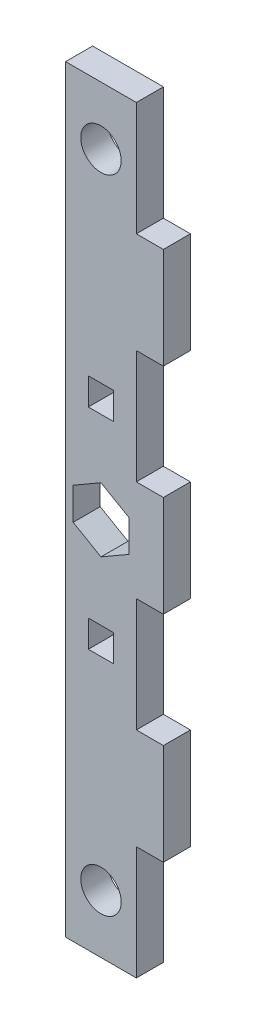
ISO-10303-21;
HEADER;
FILE_DESCRIPTION(('STEP AP214'),'2;1');
FILE_NAME('part.step','',(''),(''),'','','');
FILE_SCHEMA(('AUTOMOTIVE_DESIGN { 1 0 10303 214 1 1 1 1 }'));
ENDSEC;
DATA;
#1=APPLICATION_CONTEXT('core data for automotive mechanical design processes');
#2=APPLICATION_PROTOCOL_DEFINITION('international standard','automotive_design',2000,#1);
#3=PRODUCT_CONTEXT('',#1,'mechanical');
#4=PRODUCT('Part','Part','',(#3));
#5=PRODUCT_RELATED_PRODUCT_CATEGORY('part','',(#4));
#6=PRODUCT_DEFINITION_FORMATION('','',#4);
#7=PRODUCT_DEFINITION_CONTEXT('part definition',#1,'design');
#8=PRODUCT_DEFINITION('design','',#6,#7);
#9=PRODUCT_DEFINITION_SHAPE('','',#8);
#10=(LENGTH_UNIT() NAMED_UNIT(*) SI_UNIT(.MILLI.,.METRE.));
#11=(NAMED_UNIT(*) PLANE_ANGLE_UNIT() SI_UNIT($,.RADIAN.));
#12=(NAMED_UNIT(*) SI_UNIT($,.STERADIAN.) SOLID_ANGLE_UNIT());
#13=UNCERTAINTY_MEASURE_WITH_UNIT(LENGTH_MEASURE(1.E-05),#10,'distance_accuracy_value','');
#14=(GEOMETRIC_REPRESENTATION_CONTEXT(3) GLOBAL_UNCERTAINTY_ASSIGNED_CONTEXT((#13)) GLOBAL_UNIT_ASSIGNED_CONTEXT((#10,
#11,#12)) REPRESENTATION_CONTEXT('',''));
#15=CARTESIAN_POINT('',(0.,0.,0.));
#16=DIRECTION('',(0.,0.,1.));
#17=DIRECTION('',(1.,0.,0.));
#18=AXIS2_PLACEMENT_3D('',#15,#16,#17);
#19=CARTESIAN_POINT('',(0.,0.,5.35));
#20=DIRECTION('',(0.,0.,-1.));
#21=DIRECTION('',(-1.,0.,0.));
#22=AXIS2_PLACEMENT_3D('',#19,#20,#21);
#23=PLANE('',#22);
#24=DIRECTION('',(0.,-1.,0.));
#25=VECTOR('',#24,1.);
#26=CARTESIAN_POINT('',(4.49999999999999,56.925,5.35));
#27=LINE('',#26,#25);
#28=CARTESIAN_POINT('',(4.49999999999999,56.925,5.35));
#29=VERTEX_POINT('',#28);
#30=CARTESIAN_POINT('',(4.49999999999999,51.575,5.35));
#31=VERTEX_POINT('',#30);
#32=EDGE_CURVE('E285',#29,#31,#27,.T.);
#33=ORIENTED_EDGE('',*,*,#32,.F.);
#34=DIRECTION('',(-1.,0.,0.));
#35=VECTOR('',#34,1.);
#36=CARTESIAN_POINT('',(4.49999999999999,56.925,5.35));
#37=LINE('',#36,#35);
#38=CARTESIAN_POINT('',(9.49999999999999,56.925,5.35));
#39=VERTEX_POINT('',#38);
#40=EDGE_CURVE('E293',#39,#29,#37,.T.);
#41=ORIENTED_EDGE('',*,*,#40,.F.);
#42=DIRECTION('',(0.,1.,0.));
#43=VECTOR('',#42,1.);
#44=CARTESIAN_POINT('',(9.49999999999999,56.925,5.35));
#45=LINE('',#44,#43);
#46=CARTESIAN_POINT('',(9.49999999999999,51.575,5.35));
#47=VERTEX_POINT('',#46);
#48=EDGE_CURVE('E290',#47,#39,#45,.T.);
#49=ORIENTED_EDGE('',*,*,#48,.F.);
#50=DIRECTION('',(1.,0.,0.));
#51=VECTOR('',#50,1.);
#52=CARTESIAN_POINT('',(4.49999999999999,51.575,5.35));
#53=LINE('',#52,#51);
#54=EDGE_CURVE('E287',#31,#47,#53,.T.);
#55=ORIENTED_EDGE('',*,*,#54,.F.);
#56=EDGE_LOOP('',(#33,#41,#49,#55));
#57=FACE_BOUND('',#56,.T.);
#58=CARTESIAN_POINT('',(7.,138.5,5.35));
#59=DIRECTION('',(0.,0.,1.));
#60=DIRECTION('',(1.,0.,0.));
#61=AXIS2_PLACEMENT_3D('',#58,#59,#60);
#62=CIRCLE('',#61,4.);
#63=CARTESIAN_POINT('',(11.,138.5,5.35));
#64=VERTEX_POINT('',#63);
#65=EDGE_CURVE('E347',#64,#64,#62,.T.);
#66=ORIENTED_EDGE('',*,*,#65,.F.);
#67=EDGE_LOOP('',(#66));
#68=FACE_BOUND('',#67,.T.);
#69=DIRECTION('',(0.,-1.,0.));
#70=VECTOR('',#69,1.);
#71=CARTESIAN_POINT('',(0.,0.,5.35));
#72=LINE('',#71,#70);
#73=CARTESIAN_POINT('',(0.,150.,5.35));
#74=VERTEX_POINT('',#73);
#75=CARTESIAN_POINT('',(0.,0.,5.35));
#76=VERTEX_POINT('',#75);
#77=EDGE_CURVE('E353',#74,#76,#72,.T.);
#78=ORIENTED_EDGE('',*,*,#77,.T.);
#79=DIRECTION('',(1.,0.,0.));
#80=VECTOR('',#79,1.);
#81=CARTESIAN_POINT('',(0.,0.,5.35));
#82=LINE('',#81,#80);
#83=CARTESIAN_POINT('',(14.,0.,5.35));
#84=VERTEX_POINT('',#83);
#85=EDGE_CURVE('E356',#76,#84,#82,.T.);
#86=ORIENTED_EDGE('',*,*,#85,.T.);
#87=DIRECTION('',(0.,1.,0.));
#88=VECTOR('',#87,1.);
#89=CARTESIAN_POINT('',(14.,0.,5.35));
#90=LINE('',#89,#88);
#91=CARTESIAN_POINT('',(14.,22.5,5.35));
#92=VERTEX_POINT('',#91);
#93=EDGE_CURVE('E359',#84,#92,#90,.T.);
#94=ORIENTED_EDGE('',*,*,#93,.T.);
#95=DIRECTION('',(1.,0.,0.));
#96=VECTOR('',#95,1.);
#97=CARTESIAN_POINT('',(14.,22.5,5.35));
#98=LINE('',#97,#96);
#99=CARTESIAN_POINT('',(19.35,22.5,5.35));
#100=VERTEX_POINT('',#99);
#101=EDGE_CURVE('E361',#92,#100,#98,.T.);
#102=ORIENTED_EDGE('',*,*,#101,.T.);
#103=DIRECTION('',(0.,1.,0.));
#104=VECTOR('',#103,1.);
#105=CARTESIAN_POINT('',(19.35,22.5,5.35));
#106=LINE('',#105,#104);
#107=CARTESIAN_POINT('',(19.35,42.5,5.35));
#108=VERTEX_POINT('',#107);
#109=EDGE_CURVE('E363',#100,#108,#106,.T.);
#110=ORIENTED_EDGE('',*,*,#109,.T.);
#111=DIRECTION('',(-1.,0.,0.));
#112=VECTOR('',#111,1.);
#113=CARTESIAN_POINT('',(14.,42.5,5.35));
#114=LINE('',#113,#112);
#115=CARTESIAN_POINT('',(14.,42.5,5.35));
#116=VERTEX_POINT('',#115);
#117=EDGE_CURVE('E365',#108,#116,#114,.T.);
#118=ORIENTED_EDGE('',*,*,#117,.T.);
#119=DIRECTION('',(0.,1.,0.));
#120=VECTOR('',#119,1.);
#121=CARTESIAN_POINT('',(14.,42.5,5.35));
#122=LINE('',#121,#120);
#123=CARTESIAN_POINT('',(14.,65.,5.35));
#124=VERTEX_POINT('',#123);
#125=EDGE_CURVE('E367',#116,#124,#122,.T.);
#126=ORIENTED_EDGE('',*,*,#125,.T.);
#127=DIRECTION('',(1.,0.,0.));
#128=VECTOR('',#127,1.);
#129=CARTESIAN_POINT('',(14.,65.,5.35));
#130=LINE('',#129,#128);
#131=CARTESIAN_POINT('',(19.35,65.,5.35));
#132=VERTEX_POINT('',#131);
#133=EDGE_CURVE('E369',#124,#132,#130,.T.);
#134=ORIENTED_EDGE('',*,*,#133,.T.);
#135=DIRECTION('',(0.,1.,0.));
#136=VECTOR('',#135,1.);
#137=CARTESIAN_POINT('',(19.35,85.,5.35));
#138=LINE('',#137,#136);
#139=CARTESIAN_POINT('',(19.35,85.,5.35));
#140=VERTEX_POINT('',#139);
#141=EDGE_CURVE('E371',#132,#140,#138,.T.);
#142=ORIENTED_EDGE('',*,*,#141,.T.);
#143=DIRECTION('',(-1.,0.,0.));
#144=VECTOR('',#143,1.);
#145=CARTESIAN_POINT('',(14.,85.,5.35));
#146=LINE('',#145,#144);
#147=CARTESIAN_POINT('',(14.,85.,5.35));
#148=VERTEX_POINT('',#147);
#149=EDGE_CURVE('E373',#140,#148,#146,.T.);
#150=ORIENTED_EDGE('',*,*,#149,.T.);
#151=DIRECTION('',(0.,1.,0.));
#152=VECTOR('',#151,1.);
#153=CARTESIAN_POINT('',(14.,85.,5.35));
#154=LINE('',#153,#152);
#155=CARTESIAN_POINT('',(14.,107.5,5.35));
#156=VERTEX_POINT('',#155);
#157=EDGE_CURVE('E375',#148,#156,#154,.T.);
#158=ORIENTED_EDGE('',*,*,#157,.T.);
#159=DIRECTION('',(1.,0.,0.));
#160=VECTOR('',#159,1.);
#161=CARTESIAN_POINT('',(14.,107.5,5.35));
#162=LINE('',#161,#160);
#163=CARTESIAN_POINT('',(19.35,107.5,5.35));
#164=VERTEX_POINT('',#163);
#165=EDGE_CURVE('E377',#156,#164,#162,.T.);
#166=ORIENTED_EDGE('',*,*,#165,.T.);
#167=DIRECTION('',(0.,1.,0.));
#168=VECTOR('',#167,1.);
#169=CARTESIAN_POINT('',(19.35,127.5,5.35));
#170=LINE('',#169,#168);
#171=CARTESIAN_POINT('',(19.35,127.5,5.35));
#172=VERTEX_POINT('',#171);
#173=EDGE_CURVE('E379',#164,#172,#170,.T.);
#174=ORIENTED_EDGE('',*,*,#173,.T.);
#175=DIRECTION('',(-1.,0.,0.));
#176=VECTOR('',#175,1.);
#177=CARTESIAN_POINT('',(14.,127.5,5.35));
#178=LINE('',#177,#176);
#179=CARTESIAN_POINT('',(14.,127.5,5.35));
#180=VERTEX_POINT('',#179);
#181=EDGE_CURVE('E381',#172,#180,#178,.T.);
#182=ORIENTED_EDGE('',*,*,#181,.T.);
#183=DIRECTION('',(0.,1.,0.));
#184=VECTOR('',#183,1.);
#185=CARTESIAN_POINT('',(14.,127.5,5.35));
#186=LINE('',#185,#184);
#187=CARTESIAN_POINT('',(14.,150.,5.35));
#188=VERTEX_POINT('',#187);
#189=EDGE_CURVE('E383',#180,#188,#186,.T.);
#190=ORIENTED_EDGE('',*,*,#189,.T.);
#191=DIRECTION('',(-1.,0.,0.));
#192=VECTOR('',#191,1.);
#193=CARTESIAN_POINT('',(0.,150.,5.35));
#194=LINE('',#193,#192);
#195=EDGE_CURVE('E385',#188,#74,#194,.T.);
#196=ORIENTED_EDGE('',*,*,#195,.T.);
#197=EDGE_LOOP('',(#78,#86,#94,#102,#110,#118,#126,#134,#142,#150,#158,#166,#174,#182,#190,#196));
#198=FACE_BOUND('',#197,.T.);
#199=DIRECTION('',(0.,1.,0.));
#200=VECTOR('',#199,1.);
#201=CARTESIAN_POINT('',(9.49999999999999,93.075,5.35));
#202=LINE('',#201,#200);
#203=CARTESIAN_POINT('',(9.49999999999999,93.075,5.35));
#204=VERTEX_POINT('',#203);
#205=CARTESIAN_POINT('',(9.49999999999999,98.425,5.35));
#206=VERTEX_POINT('',#205);
#207=EDGE_CURVE('E316',#204,#206,#202,.T.);
#208=ORIENTED_EDGE('',*,*,#207,.F.);
#209=DIRECTION('',(1.,0.,0.));
#210=VECTOR('',#209,1.);
#211=CARTESIAN_POINT('',(4.49999999999999,93.075,5.35));
#212=LINE('',#211,#210);
#213=CARTESIAN_POINT('',(4.49999999999999,93.075,5.35));
#214=VERTEX_POINT('',#213);
#215=EDGE_CURVE('E324',#214,#204,#212,.T.);
#216=ORIENTED_EDGE('',*,*,#215,.F.);
#217=DIRECTION('',(0.,-1.,0.));
#218=VECTOR('',#217,1.);
#219=CARTESIAN_POINT('',(4.49999999999999,93.075,5.35));
#220=LINE('',#219,#218);
#221=CARTESIAN_POINT('',(4.49999999999999,98.425,5.35));
#222=VERTEX_POINT('',#221);
#223=EDGE_CURVE('E321',#222,#214,#220,.T.);
#224=ORIENTED_EDGE('',*,*,#223,.F.);
#225=DIRECTION('',(-1.,0.,0.));
#226=VECTOR('',#225,1.);
#227=CARTESIAN_POINT('',(4.49999999999999,98.425,5.35));
#228=LINE('',#227,#226);
#229=EDGE_CURVE('E318',#206,#222,#228,.T.);
#230=ORIENTED_EDGE('',*,*,#229,.F.);
#231=EDGE_LOOP('',(#208,#216,#224,#230));
#232=FACE_BOUND('',#231,.T.);
#233=DIRECTION('',(-0.866025403784439,0.5,0.));
#234=VECTOR('',#233,1.);
#235=CARTESIAN_POINT('',(12.5,78.1754264805429,5.35));
#236=LINE('',#235,#234);
#237=CARTESIAN_POINT('',(12.5,78.1754264805429,5.35));
#238=VERTEX_POINT('',#237);
#239=CARTESIAN_POINT('',(7.00000000000001,81.3508529610859,5.35));
#240=VERTEX_POINT('',#239);
#241=EDGE_CURVE('E231',#238,#240,#236,.T.);
#242=ORIENTED_EDGE('',*,*,#241,.F.);
#243=DIRECTION('',(0.,1.,0.));
#244=VECTOR('',#243,1.);
#245=CARTESIAN_POINT('',(12.5,71.8245735194571,5.35));
#246=LINE('',#245,#244);
#247=CARTESIAN_POINT('',(12.5,71.8245735194571,5.35));
#248=VERTEX_POINT('',#247);
#249=EDGE_CURVE('E262',#248,#238,#246,.T.);
#250=ORIENTED_EDGE('',*,*,#249,.F.);
#251=DIRECTION('',(0.866025403784438,0.500000000000001,0.));
#252=VECTOR('',#251,1.);
#253=CARTESIAN_POINT('',(6.99999999999999,68.6491470389141,5.35));
#254=LINE('',#253,#252);
#255=CARTESIAN_POINT('',(6.99999999999999,68.6491470389141,5.35));
#256=VERTEX_POINT('',#255);
#257=EDGE_CURVE('E260',#256,#248,#254,.T.);
#258=ORIENTED_EDGE('',*,*,#257,.F.);
#259=DIRECTION('',(0.866025403784438,-0.500000000000002,0.));
#260=VECTOR('',#259,1.);
#261=CARTESIAN_POINT('',(1.5,71.8245735194571,5.35));
#262=LINE('',#261,#260);
#263=CARTESIAN_POINT('',(1.5,71.8245735194571,5.35));
#264=VERTEX_POINT('',#263);
#265=EDGE_CURVE('E255',#264,#256,#262,.T.);
#266=ORIENTED_EDGE('',*,*,#265,.F.);
#267=DIRECTION('',(0.,-1.,0.));
#268=VECTOR('',#267,1.);
#269=CARTESIAN_POINT('',(1.5,78.1754264805429,5.35));
#270=LINE('',#269,#268);
#271=CARTESIAN_POINT('',(1.5,78.1754264805429,5.35));
#272=VERTEX_POINT('',#271);
#273=EDGE_CURVE('E253',#272,#264,#270,.T.);
#274=ORIENTED_EDGE('',*,*,#273,.F.);
#275=DIRECTION('',(-0.866025403784439,-0.5,0.));
#276=VECTOR('',#275,1.);
#277=CARTESIAN_POINT('',(7.00000000000001,81.3508529610859,5.35));
#278=LINE('',#277,#276);
#279=EDGE_CURVE('E239',#240,#272,#278,.T.);
#280=ORIENTED_EDGE('',*,*,#279,.F.);
#281=EDGE_LOOP('',(#242,#250,#258,#266,#274,#280));
#282=FACE_BOUND('',#281,.T.);
#283=CARTESIAN_POINT('',(7.,11.5,5.35));
#284=DIRECTION('',(0.,0.,1.));
#285=DIRECTION('',(-1.,0.,0.));
#286=AXIS2_PLACEMENT_3D('',#283,#284,#285);
#287=CIRCLE('',#286,4.);
#288=CARTESIAN_POINT('',(3.,11.5,5.35));
#289=VERTEX_POINT('',#288);
#290=EDGE_CURVE('E265',#289,#289,#287,.T.);
#291=ORIENTED_EDGE('',*,*,#290,.F.);
#292=EDGE_LOOP('',(#291));
#293=FACE_BOUND('',#292,.T.);
#294=ADVANCED_FACE('F34',(#57,#68,#198,#232,#282,#293),#23,.F.);
#295=CARTESIAN_POINT('',(0.,0.,0.));
#296=DIRECTION('',(0.,0.,-1.));
#297=DIRECTION('',(-1.,0.,0.));
#298=AXIS2_PLACEMENT_3D('',#295,#296,#297);
#299=PLANE('',#298);
#300=DIRECTION('',(0.,1.,0.));
#301=VECTOR('',#300,1.);
#302=CARTESIAN_POINT('',(12.5,71.8245735194571,0.));
#303=LINE('',#302,#301);
#304=CARTESIAN_POINT('',(12.5,71.8245735194571,0.));
#305=VERTEX_POINT('',#304);
#306=CARTESIAN_POINT('',(12.5,78.1754264805429,0.));
#307=VERTEX_POINT('',#306);
#308=EDGE_CURVE('E240',#305,#307,#303,.T.);
#309=ORIENTED_EDGE('',*,*,#308,.T.);
#310=DIRECTION('',(-0.866025403784439,0.5,0.));
#311=VECTOR('',#310,1.);
#312=CARTESIAN_POINT('',(12.5,78.1754264805429,0.));
#313=LINE('',#312,#311);
#314=CARTESIAN_POINT('',(7.00000000000001,81.3508529610859,0.));
#315=VERTEX_POINT('',#314);
#316=EDGE_CURVE('E57',#307,#315,#313,.T.);
#317=ORIENTED_EDGE('',*,*,#316,.T.);
#318=DIRECTION('',(-0.866025403784439,-0.5,0.));
#319=VECTOR('',#318,1.);
#320=CARTESIAN_POINT('',(7.00000000000001,81.3508529610859,0.));
#321=LINE('',#320,#319);
#322=CARTESIAN_POINT('',(1.5,78.1754264805429,0.));
#323=VERTEX_POINT('',#322);
#324=EDGE_CURVE('E246',#315,#323,#321,.T.);
#325=ORIENTED_EDGE('',*,*,#324,.T.);
#326=DIRECTION('',(0.,-1.,0.));
#327=VECTOR('',#326,1.);
#328=CARTESIAN_POINT('',(1.5,78.1754264805429,0.));
#329=LINE('',#328,#327);
#330=CARTESIAN_POINT('',(1.5,71.8245735194571,0.));
#331=VERTEX_POINT('',#330);
#332=EDGE_CURVE('E267',#323,#331,#329,.T.);
#333=ORIENTED_EDGE('',*,*,#332,.T.);
#334=DIRECTION('',(0.866025403784438,-0.500000000000002,0.));
#335=VECTOR('',#334,1.);
#336=CARTESIAN_POINT('',(1.5,71.8245735194571,0.));
#337=LINE('',#336,#335);
#338=CARTESIAN_POINT('',(6.99999999999999,68.6491470389141,0.));
#339=VERTEX_POINT('',#338);
#340=EDGE_CURVE('E270',#331,#339,#337,.T.);
#341=ORIENTED_EDGE('',*,*,#340,.T.);
#342=DIRECTION('',(0.866025403784438,0.500000000000001,0.));
#343=VECTOR('',#342,1.);
#344=CARTESIAN_POINT('',(6.99999999999999,68.6491470389141,0.));
#345=LINE('',#344,#343);
#346=EDGE_CURVE('E273',#339,#305,#345,.T.);
#347=ORIENTED_EDGE('',*,*,#346,.T.);
#348=EDGE_LOOP('',(#309,#317,#325,#333,#341,#347));
#349=FACE_BOUND('',#348,.T.);
#350=DIRECTION('',(-1.,0.,0.));
#351=VECTOR('',#350,1.);
#352=CARTESIAN_POINT('',(4.49999999999999,56.925,0.));
#353=LINE('',#352,#351);
#354=CARTESIAN_POINT('',(9.49999999999999,56.925,0.));
#355=VERTEX_POINT('',#354);
#356=CARTESIAN_POINT('',(4.49999999999999,56.925,0.));
#357=VERTEX_POINT('',#356);
#358=EDGE_CURVE('E288',#355,#357,#353,.T.);
#359=ORIENTED_EDGE('',*,*,#358,.T.);
#360=DIRECTION('',(0.,-1.,0.));
#361=VECTOR('',#360,1.);
#362=CARTESIAN_POINT('',(4.49999999999999,56.925,0.));
#363=LINE('',#362,#361);
#364=CARTESIAN_POINT('',(4.49999999999999,51.575,0.));
#365=VERTEX_POINT('',#364);
#366=EDGE_CURVE('E247',#357,#365,#363,.T.);
#367=ORIENTED_EDGE('',*,*,#366,.T.);
#368=DIRECTION('',(1.,0.,0.));
#369=VECTOR('',#368,1.);
#370=CARTESIAN_POINT('',(4.49999999999999,51.575,0.));
#371=LINE('',#370,#369);
#372=CARTESIAN_POINT('',(9.49999999999999,51.575,0.));
#373=VERTEX_POINT('',#372);
#374=EDGE_CURVE('E298',#365,#373,#371,.T.);
#375=ORIENTED_EDGE('',*,*,#374,.T.);
#376=DIRECTION('',(0.,1.,0.));
#377=VECTOR('',#376,1.);
#378=CARTESIAN_POINT('',(9.49999999999999,56.925,0.));
#379=LINE('',#378,#377);
#380=EDGE_CURVE('E301',#373,#355,#379,.T.);
#381=ORIENTED_EDGE('',*,*,#380,.T.);
#382=EDGE_LOOP('',(#359,#367,#375,#381));
#383=FACE_BOUND('',#382,.T.);
#384=DIRECTION('',(1.,0.,0.));
#385=VECTOR('',#384,1.);
#386=CARTESIAN_POINT('',(4.49999999999999,93.075,0.));
#387=LINE('',#386,#385);
#388=CARTESIAN_POINT('',(4.49999999999999,93.075,0.));
#389=VERTEX_POINT('',#388);
#390=CARTESIAN_POINT('',(9.49999999999999,93.075,0.));
#391=VERTEX_POINT('',#390);
#392=EDGE_CURVE('E319',#389,#391,#387,.T.);
#393=ORIENTED_EDGE('',*,*,#392,.T.);
#394=DIRECTION('',(0.,1.,0.));
#395=VECTOR('',#394,1.);
#396=CARTESIAN_POINT('',(9.49999999999999,93.075,0.));
#397=LINE('',#396,#395);
#398=CARTESIAN_POINT('',(9.49999999999999,98.425,0.));
#399=VERTEX_POINT('',#398);
#400=EDGE_CURVE('E315',#391,#399,#397,.T.);
#401=ORIENTED_EDGE('',*,*,#400,.T.);
#402=DIRECTION('',(-1.,0.,0.));
#403=VECTOR('',#402,1.);
#404=CARTESIAN_POINT('',(4.49999999999999,98.425,0.));
#405=LINE('',#404,#403);
#406=CARTESIAN_POINT('',(4.49999999999999,98.425,0.));
#407=VERTEX_POINT('',#406);
#408=EDGE_CURVE('E329',#399,#407,#405,.T.);
#409=ORIENTED_EDGE('',*,*,#408,.T.);
#410=DIRECTION('',(0.,-1.,0.));
#411=VECTOR('',#410,1.);
#412=CARTESIAN_POINT('',(4.49999999999999,93.075,0.));
#413=LINE('',#412,#411);
#414=EDGE_CURVE('E332',#407,#389,#413,.T.);
#415=ORIENTED_EDGE('',*,*,#414,.T.);
#416=EDGE_LOOP('',(#393,#401,#409,#415));
#417=FACE_BOUND('',#416,.T.);
#418=CARTESIAN_POINT('',(7.,138.5,0.));
#419=DIRECTION('',(0.,0.,1.));
#420=DIRECTION('',(1.,0.,0.));
#421=AXIS2_PLACEMENT_3D('',#418,#419,#420);
#422=CIRCLE('',#421,4.);
#423=CARTESIAN_POINT('',(11.,138.5,0.));
#424=VERTEX_POINT('',#423);
#425=EDGE_CURVE('E346',#424,#424,#422,.T.);
#426=ORIENTED_EDGE('',*,*,#425,.T.);
#427=EDGE_LOOP('',(#426));
#428=FACE_BOUND('',#427,.T.);
#429=DIRECTION('',(0.,-1.,0.));
#430=VECTOR('',#429,1.);
#431=CARTESIAN_POINT('',(0.,0.,0.));
#432=LINE('',#431,#430);
#433=CARTESIAN_POINT('',(0.,150.,0.));
#434=VERTEX_POINT('',#433);
#435=CARTESIAN_POINT('',(0.,0.,0.));
#436=VERTEX_POINT('',#435);
#437=EDGE_CURVE('E350',#434,#436,#432,.T.);
#438=ORIENTED_EDGE('',*,*,#437,.F.);
#439=DIRECTION('',(-1.,0.,0.));
#440=VECTOR('',#439,1.);
#441=CARTESIAN_POINT('',(0.,150.,0.));
#442=LINE('',#441,#440);
#443=CARTESIAN_POINT('',(14.,150.,0.));
#444=VERTEX_POINT('',#443);
#445=EDGE_CURVE('E357',#444,#434,#442,.T.);
#446=ORIENTED_EDGE('',*,*,#445,.F.);
#447=DIRECTION('',(0.,1.,0.));
#448=VECTOR('',#447,1.);
#449=CARTESIAN_POINT('',(14.,127.5,0.));
#450=LINE('',#449,#448);
#451=CARTESIAN_POINT('',(14.,127.5,0.));
#452=VERTEX_POINT('',#451);
#453=EDGE_CURVE('E416',#452,#444,#450,.T.);
#454=ORIENTED_EDGE('',*,*,#453,.F.);
#455=DIRECTION('',(-1.,0.,0.));
#456=VECTOR('',#455,1.);
#457=CARTESIAN_POINT('',(14.,127.5,0.));
#458=LINE('',#457,#456);
#459=CARTESIAN_POINT('',(19.35,127.5,0.));
#460=VERTEX_POINT('',#459);
#461=EDGE_CURVE('E414',#460,#452,#458,.T.);
#462=ORIENTED_EDGE('',*,*,#461,.F.);
#463=DIRECTION('',(0.,1.,0.));
#464=VECTOR('',#463,1.);
#465=CARTESIAN_POINT('',(19.35,127.5,0.));
#466=LINE('',#465,#464);
#467=CARTESIAN_POINT('',(19.35,107.5,0.));
#468=VERTEX_POINT('',#467);
#469=EDGE_CURVE('E412',#468,#460,#466,.T.);
#470=ORIENTED_EDGE('',*,*,#469,.F.);
#471=DIRECTION('',(1.,0.,0.));
#472=VECTOR('',#471,1.);
#473=CARTESIAN_POINT('',(14.,107.5,0.));
#474=LINE('',#473,#472);
#475=CARTESIAN_POINT('',(14.,107.5,0.));
#476=VERTEX_POINT('',#475);
#477=EDGE_CURVE('E410',#476,#468,#474,.T.);
#478=ORIENTED_EDGE('',*,*,#477,.F.);
#479=DIRECTION('',(0.,1.,0.));
#480=VECTOR('',#479,1.);
#481=CARTESIAN_POINT('',(14.,85.,0.));
#482=LINE('',#481,#480);
#483=CARTESIAN_POINT('',(14.,85.,0.));
#484=VERTEX_POINT('',#483);
#485=EDGE_CURVE('E408',#484,#476,#482,.T.);
#486=ORIENTED_EDGE('',*,*,#485,.F.);
#487=DIRECTION('',(-1.,0.,0.));
#488=VECTOR('',#487,1.);
#489=CARTESIAN_POINT('',(14.,85.,0.));
#490=LINE('',#489,#488);
#491=CARTESIAN_POINT('',(19.35,85.,0.));
#492=VERTEX_POINT('',#491);
#493=EDGE_CURVE('E406',#492,#484,#490,.T.);
#494=ORIENTED_EDGE('',*,*,#493,.F.);
#495=DIRECTION('',(0.,1.,0.));
#496=VECTOR('',#495,1.);
#497=CARTESIAN_POINT('',(19.35,85.,0.));
#498=LINE('',#497,#496);
#499=CARTESIAN_POINT('',(19.35,65.,0.));
#500=VERTEX_POINT('',#499);
#501=EDGE_CURVE('E404',#500,#492,#498,.T.);
#502=ORIENTED_EDGE('',*,*,#501,.F.);
#503=DIRECTION('',(1.,0.,0.));
#504=VECTOR('',#503,1.);
#505=CARTESIAN_POINT('',(14.,65.,0.));
#506=LINE('',#505,#504);
#507=CARTESIAN_POINT('',(14.,65.,0.));
#508=VERTEX_POINT('',#507);
#509=EDGE_CURVE('E402',#508,#500,#506,.T.);
#510=ORIENTED_EDGE('',*,*,#509,.F.);
#511=DIRECTION('',(0.,1.,0.));
#512=VECTOR('',#511,1.);
#513=CARTESIAN_POINT('',(14.,42.5,0.));
#514=LINE('',#513,#512);
#515=CARTESIAN_POINT('',(14.,42.5,0.));
#516=VERTEX_POINT('',#515);
#517=EDGE_CURVE('E400',#516,#508,#514,.T.);
#518=ORIENTED_EDGE('',*,*,#517,.F.);
#519=DIRECTION('',(-1.,0.,0.));
#520=VECTOR('',#519,1.);
#521=CARTESIAN_POINT('',(14.,42.5,0.));
#522=LINE('',#521,#520);
#523=CARTESIAN_POINT('',(19.35,42.5,0.));
#524=VERTEX_POINT('',#523);
#525=EDGE_CURVE('E398',#524,#516,#522,.T.);
#526=ORIENTED_EDGE('',*,*,#525,.F.);
#527=DIRECTION('',(0.,1.,0.));
#528=VECTOR('',#527,1.);
#529=CARTESIAN_POINT('',(19.35,22.5,0.));
#530=LINE('',#529,#528);
#531=CARTESIAN_POINT('',(19.35,22.5,0.));
#532=VERTEX_POINT('',#531);
#533=EDGE_CURVE('E396',#532,#524,#530,.T.);
#534=ORIENTED_EDGE('',*,*,#533,.F.);
#535=DIRECTION('',(1.,0.,0.));
#536=VECTOR('',#535,1.);
#537=CARTESIAN_POINT('',(14.,22.5,0.));
#538=LINE('',#537,#536);
#539=CARTESIAN_POINT('',(14.,22.5,0.));
#540=VERTEX_POINT('',#539);
#541=EDGE_CURVE('E394',#540,#532,#538,.T.);
#542=ORIENTED_EDGE('',*,*,#541,.F.);
#543=DIRECTION('',(0.,1.,0.));
#544=VECTOR('',#543,1.);
#545=CARTESIAN_POINT('',(14.,0.,0.));
#546=LINE('',#545,#544);
#547=CARTESIAN_POINT('',(14.,0.,0.));
#548=VERTEX_POINT('',#547);
#549=EDGE_CURVE('E392',#548,#540,#546,.T.);
#550=ORIENTED_EDGE('',*,*,#549,.F.);
#551=DIRECTION('',(1.,0.,0.));
#552=VECTOR('',#551,1.);
#553=CARTESIAN_POINT('',(0.,0.,0.));
#554=LINE('',#553,#552);
#555=EDGE_CURVE('E390',#436,#548,#554,.T.);
#556=ORIENTED_EDGE('',*,*,#555,.F.);
#557=EDGE_LOOP('',(#438,#446,#454,#462,#470,#478,#486,#494,#502,#510,#518,#526,#534,#542,#550,#556));
#558=FACE_BOUND('',#557,.T.);
#559=CARTESIAN_POINT('',(7.,11.5,0.));
#560=DIRECTION('',(0.,0.,1.));
#561=DIRECTION('',(-1.,0.,0.));
#562=AXIS2_PLACEMENT_3D('',#559,#560,#561);
#563=CIRCLE('',#562,4.);
#564=CARTESIAN_POINT('',(3.,11.5,0.));
#565=VERTEX_POINT('',#564);
#566=EDGE_CURVE('E848',#565,#565,#563,.T.);
#567=ORIENTED_EDGE('',*,*,#566,.T.);
#568=EDGE_LOOP('',(#567));
#569=FACE_BOUND('',#568,.T.);
#570=ADVANCED_FACE('F470',(#349,#383,#417,#428,#558,#569),#299,.T.);
#571=CARTESIAN_POINT('',(0.,0.,5.35));
#572=DIRECTION('',(1.,0.,0.));
#573=DIRECTION('',(0.,0.,-1.));
#574=AXIS2_PLACEMENT_3D('',#571,#572,#573);
#575=PLANE('',#574);
#576=ORIENTED_EDGE('',*,*,#437,.T.);
#577=DIRECTION('',(0.,0.,-1.));
#578=VECTOR('',#577,1.);
#579=CARTESIAN_POINT('',(0.,0.,5.35));
#580=LINE('',#579,#578);
#581=EDGE_CURVE('E11',#76,#436,#580,.T.);
#582=ORIENTED_EDGE('',*,*,#581,.F.);
#583=ORIENTED_EDGE('',*,*,#77,.F.);
#584=DIRECTION('',(0.,0.,-1.));
#585=VECTOR('',#584,1.);
#586=CARTESIAN_POINT('',(0.,150.,5.35));
#587=LINE('',#586,#585);
#588=EDGE_CURVE('E387',#74,#434,#587,.T.);
#589=ORIENTED_EDGE('',*,*,#588,.T.);
#590=EDGE_LOOP('',(#576,#582,#583,#589));
#591=FACE_BOUND('',#590,.T.);
#592=ADVANCED_FACE('F36',(#591),#575,.F.);
#593=CARTESIAN_POINT('',(0.,0.,5.35));
#594=DIRECTION('',(0.,1.,0.));
#595=DIRECTION('',(0.,0.,1.));
#596=AXIS2_PLACEMENT_3D('',#593,#594,#595);
#597=PLANE('',#596);
#598=ORIENTED_EDGE('',*,*,#555,.T.);
#599=DIRECTION('',(0.,0.,-1.));
#600=VECTOR('',#599,1.);
#601=CARTESIAN_POINT('',(14.,0.,5.35));
#602=LINE('',#601,#600);
#603=EDGE_CURVE('E42',#84,#548,#602,.T.);
#604=ORIENTED_EDGE('',*,*,#603,.F.);
#605=ORIENTED_EDGE('',*,*,#85,.F.);
#606=ORIENTED_EDGE('',*,*,#581,.T.);
#607=EDGE_LOOP('',(#598,#604,#605,#606));
#608=FACE_BOUND('',#607,.T.);
#609=ADVANCED_FACE('F488',(#608),#597,.F.);
#610=CARTESIAN_POINT('',(14.,0.,5.35));
#611=DIRECTION('',(-1.,0.,0.));
#612=DIRECTION('',(0.,0.,1.));
#613=AXIS2_PLACEMENT_3D('',#610,#611,#612);
#614=PLANE('',#613);
#615=ORIENTED_EDGE('',*,*,#549,.T.);
#616=DIRECTION('',(0.,0.,-1.));
#617=VECTOR('',#616,1.);
#618=CARTESIAN_POINT('',(14.,22.5,5.35));
#619=LINE('',#618,#617);
#620=EDGE_CURVE('E457',#92,#540,#619,.T.);
#621=ORIENTED_EDGE('',*,*,#620,.F.);
#622=ORIENTED_EDGE('',*,*,#93,.F.);
#623=ORIENTED_EDGE('',*,*,#603,.T.);
#624=EDGE_LOOP('',(#615,#621,#622,#623));
#625=FACE_BOUND('',#624,.T.);
#626=ADVANCED_FACE('F464',(#625),#614,.F.);
#627=CARTESIAN_POINT('',(14.,22.5,5.35));
#628=DIRECTION('',(0.,1.,0.));
#629=DIRECTION('',(0.,0.,1.));
#630=AXIS2_PLACEMENT_3D('',#627,#628,#629);
#631=PLANE('',#630);
#632=ORIENTED_EDGE('',*,*,#541,.T.);
#633=DIRECTION('',(0.,0.,-1.));
#634=VECTOR('',#633,1.);
#635=CARTESIAN_POINT('',(19.35,22.5,5.35));
#636=LINE('',#635,#634);
#637=EDGE_CURVE('E454',#100,#532,#636,.T.);
#638=ORIENTED_EDGE('',*,*,#637,.F.);
#639=ORIENTED_EDGE('',*,*,#101,.F.);
#640=ORIENTED_EDGE('',*,*,#620,.T.);
#641=EDGE_LOOP('',(#632,#638,#639,#640));
#642=FACE_BOUND('',#641,.T.);
#643=ADVANCED_FACE('F476',(#642),#631,.F.);
#644=CARTESIAN_POINT('',(19.35,22.5,5.35));
#645=DIRECTION('',(-1.,0.,0.));
#646=DIRECTION('',(0.,0.,1.));
#647=AXIS2_PLACEMENT_3D('',#644,#645,#646);
#648=PLANE('',#647);
#649=ORIENTED_EDGE('',*,*,#533,.T.);
#650=DIRECTION('',(0.,0.,-1.));
#651=VECTOR('',#650,1.);
#652=CARTESIAN_POINT('',(19.35,42.5,5.35));
#653=LINE('',#652,#651);
#654=EDGE_CURVE('E451',#108,#524,#653,.T.);
#655=ORIENTED_EDGE('',*,*,#654,.F.);
#656=ORIENTED_EDGE('',*,*,#109,.F.);
#657=ORIENTED_EDGE('',*,*,#637,.T.);
#658=EDGE_LOOP('',(#649,#655,#656,#657));
#659=FACE_BOUND('',#658,.T.);
#660=ADVANCED_FACE('F480',(#659),#648,.F.);
#661=CARTESIAN_POINT('',(14.,42.5,5.35));
#662=DIRECTION('',(0.,-1.,0.));
#663=DIRECTION('',(0.,0.,-1.));
#664=AXIS2_PLACEMENT_3D('',#661,#662,#663);
#665=PLANE('',#664);
#666=ORIENTED_EDGE('',*,*,#525,.T.);
#667=DIRECTION('',(0.,0.,-1.));
#668=VECTOR('',#667,1.);
#669=CARTESIAN_POINT('',(14.,42.5,5.35));
#670=LINE('',#669,#668);
#671=EDGE_CURVE('E448',#116,#516,#670,.T.);
#672=ORIENTED_EDGE('',*,*,#671,.F.);
#673=ORIENTED_EDGE('',*,*,#117,.F.);
#674=ORIENTED_EDGE('',*,*,#654,.T.);
#675=EDGE_LOOP('',(#666,#672,#673,#674));
#676=FACE_BOUND('',#675,.T.);
#677=ADVANCED_FACE('F541',(#676),#665,.F.);
#678=CARTESIAN_POINT('',(14.,42.5,5.35));
#679=DIRECTION('',(-1.,0.,0.));
#680=DIRECTION('',(0.,-1.,0.));
#681=AXIS2_PLACEMENT_3D('',#678,#679,#680);
#682=PLANE('',#681);
#683=ORIENTED_EDGE('',*,*,#517,.T.);
#684=DIRECTION('',(0.,0.,-1.));
#685=VECTOR('',#684,1.);
#686=CARTESIAN_POINT('',(14.,65.,5.35));
#687=LINE('',#686,#685);
#688=EDGE_CURVE('E445',#124,#508,#687,.T.);
#689=ORIENTED_EDGE('',*,*,#688,.F.);
#690=ORIENTED_EDGE('',*,*,#125,.F.);
#691=ORIENTED_EDGE('',*,*,#671,.T.);
#692=EDGE_LOOP('',(#683,#689,#690,#691));
#693=FACE_BOUND('',#692,.T.);
#694=ADVANCED_FACE('F538',(#693),#682,.F.);
#695=CARTESIAN_POINT('',(14.,65.,5.35));
#696=DIRECTION('',(0.,1.,0.));
#697=DIRECTION('',(-1.,0.,0.));
#698=AXIS2_PLACEMENT_3D('',#695,#696,#697);
#699=PLANE('',#698);
#700=ORIENTED_EDGE('',*,*,#509,.T.);
#701=DIRECTION('',(0.,0.,-1.));
#702=VECTOR('',#701,1.);
#703=CARTESIAN_POINT('',(19.35,65.,5.35));
#704=LINE('',#703,#702);
#705=EDGE_CURVE('E442',#132,#500,#704,.T.);
#706=ORIENTED_EDGE('',*,*,#705,.F.);
#707=ORIENTED_EDGE('',*,*,#133,.F.);
#708=ORIENTED_EDGE('',*,*,#688,.T.);
#709=EDGE_LOOP('',(#700,#706,#707,#708));
#710=FACE_BOUND('',#709,.T.);
#711=ADVANCED_FACE('F534',(#710),#699,.F.);
#712=CARTESIAN_POINT('',(19.35,85.,5.35));
#713=DIRECTION('',(-1.,0.,0.));
#714=DIRECTION('',(0.,-1.,0.));
#715=AXIS2_PLACEMENT_3D('',#712,#713,#714);
#716=PLANE('',#715);
#717=ORIENTED_EDGE('',*,*,#501,.T.);
#718=DIRECTION('',(0.,0.,-1.));
#719=VECTOR('',#718,1.);
#720=CARTESIAN_POINT('',(19.35,85.,5.35));
#721=LINE('',#720,#719);
#722=EDGE_CURVE('E439',#140,#492,#721,.T.);
#723=ORIENTED_EDGE('',*,*,#722,.F.);
#724=ORIENTED_EDGE('',*,*,#141,.F.);
#725=ORIENTED_EDGE('',*,*,#705,.T.);
#726=EDGE_LOOP('',(#717,#723,#724,#725));
#727=FACE_BOUND('',#726,.T.);
#728=ADVANCED_FACE('F530',(#727),#716,.F.);
#729=CARTESIAN_POINT('',(14.,85.,5.35));
#730=DIRECTION('',(0.,-1.,0.));
#731=DIRECTION('',(1.,0.,0.));
#732=AXIS2_PLACEMENT_3D('',#729,#730,#731);
#733=PLANE('',#732);
#734=ORIENTED_EDGE('',*,*,#493,.T.);
#735=DIRECTION('',(0.,0.,-1.));
#736=VECTOR('',#735,1.);
#737=CARTESIAN_POINT('',(14.,85.,5.35));
#738=LINE('',#737,#736);
#739=EDGE_CURVE('E436',#148,#484,#738,.T.);
#740=ORIENTED_EDGE('',*,*,#739,.F.);
#741=ORIENTED_EDGE('',*,*,#149,.F.);
#742=ORIENTED_EDGE('',*,*,#722,.T.);
#743=EDGE_LOOP('',(#734,#740,#741,#742));
#744=FACE_BOUND('',#743,.T.);
#745=ADVANCED_FACE('F525',(#744),#733,.F.);
#746=CARTESIAN_POINT('',(14.,85.,5.35));
#747=DIRECTION('',(-1.,0.,0.));
#748=DIRECTION('',(0.,-1.,0.));
#749=AXIS2_PLACEMENT_3D('',#746,#747,#748);
#750=PLANE('',#749);
#751=ORIENTED_EDGE('',*,*,#485,.T.);
#752=DIRECTION('',(0.,0.,-1.));
#753=VECTOR('',#752,1.);
#754=CARTESIAN_POINT('',(14.,107.5,5.35));
#755=LINE('',#754,#753);
#756=EDGE_CURVE('E433',#156,#476,#755,.T.);
#757=ORIENTED_EDGE('',*,*,#756,.F.);
#758=ORIENTED_EDGE('',*,*,#157,.F.);
#759=ORIENTED_EDGE('',*,*,#739,.T.);
#760=EDGE_LOOP('',(#751,#757,#758,#759));
#761=FACE_BOUND('',#760,.T.);
#762=ADVANCED_FACE('F519',(#761),#750,.F.);
#763=CARTESIAN_POINT('',(14.,107.5,5.35));
#764=DIRECTION('',(0.,1.,0.));
#765=DIRECTION('',(-1.,0.,0.));
#766=AXIS2_PLACEMENT_3D('',#763,#764,#765);
#767=PLANE('',#766);
#768=ORIENTED_EDGE('',*,*,#477,.T.);
#769=DIRECTION('',(0.,0.,-1.));
#770=VECTOR('',#769,1.);
#771=CARTESIAN_POINT('',(19.35,107.5,5.35));
#772=LINE('',#771,#770);
#773=EDGE_CURVE('E430',#164,#468,#772,.T.);
#774=ORIENTED_EDGE('',*,*,#773,.F.);
#775=ORIENTED_EDGE('',*,*,#165,.F.);
#776=ORIENTED_EDGE('',*,*,#756,.T.);
#777=EDGE_LOOP('',(#768,#774,#775,#776));
#778=FACE_BOUND('',#777,.T.);
#779=ADVANCED_FACE('F515',(#778),#767,.F.);
#780=CARTESIAN_POINT('',(19.35,127.5,5.35));
#781=DIRECTION('',(-1.,0.,0.));
#782=DIRECTION('',(0.,-1.,0.));
#783=AXIS2_PLACEMENT_3D('',#780,#781,#782);
#784=PLANE('',#783);
#785=ORIENTED_EDGE('',*,*,#469,.T.);
#786=DIRECTION('',(0.,0.,-1.));
#787=VECTOR('',#786,1.);
#788=CARTESIAN_POINT('',(19.35,127.5,5.35));
#789=LINE('',#788,#787);
#790=EDGE_CURVE('E427',#172,#460,#789,.T.);
#791=ORIENTED_EDGE('',*,*,#790,.F.);
#792=ORIENTED_EDGE('',*,*,#173,.F.);
#793=ORIENTED_EDGE('',*,*,#773,.T.);
#794=EDGE_LOOP('',(#785,#791,#792,#793));
#795=FACE_BOUND('',#794,.T.);
#796=ADVANCED_FACE('F510',(#795),#784,.F.);
#797=CARTESIAN_POINT('',(14.,127.5,5.35));
#798=DIRECTION('',(0.,-1.,0.));
#799=DIRECTION('',(0.,0.,-1.));
#800=AXIS2_PLACEMENT_3D('',#797,#798,#799);
#801=PLANE('',#800);
#802=ORIENTED_EDGE('',*,*,#461,.T.);
#803=DIRECTION('',(0.,0.,-1.));
#804=VECTOR('',#803,1.);
#805=CARTESIAN_POINT('',(14.,127.5,5.35));
#806=LINE('',#805,#804);
#807=EDGE_CURVE('E424',#180,#452,#806,.T.);
#808=ORIENTED_EDGE('',*,*,#807,.F.);
#809=ORIENTED_EDGE('',*,*,#181,.F.);
#810=ORIENTED_EDGE('',*,*,#790,.T.);
#811=EDGE_LOOP('',(#802,#808,#809,#810));
#812=FACE_BOUND('',#811,.T.);
#813=ADVANCED_FACE('F504',(#812),#801,.F.);
#814=CARTESIAN_POINT('',(14.,127.5,5.35));
#815=DIRECTION('',(-1.,0.,0.));
#816=DIRECTION('',(0.,-1.,0.));
#817=AXIS2_PLACEMENT_3D('',#814,#815,#816);
#818=PLANE('',#817);
#819=ORIENTED_EDGE('',*,*,#453,.T.);
#820=DIRECTION('',(0.,0.,-1.));
#821=VECTOR('',#820,1.);
#822=CARTESIAN_POINT('',(14.,150.,5.35));
#823=LINE('',#822,#821);
#824=EDGE_CURVE('E421',#188,#444,#823,.T.);
#825=ORIENTED_EDGE('',*,*,#824,.F.);
#826=ORIENTED_EDGE('',*,*,#189,.F.);
#827=ORIENTED_EDGE('',*,*,#807,.T.);
#828=EDGE_LOOP('',(#819,#825,#826,#827));
#829=FACE_BOUND('',#828,.T.);
#830=ADVANCED_FACE('F500',(#829),#818,.F.);
#831=CARTESIAN_POINT('',(0.,150.,5.35));
#832=DIRECTION('',(0.,-1.,0.));
#833=DIRECTION('',(0.,0.,-1.));
#834=AXIS2_PLACEMENT_3D('',#831,#832,#833);
#835=PLANE('',#834);
#836=ORIENTED_EDGE('',*,*,#445,.T.);
#837=ORIENTED_EDGE('',*,*,#588,.F.);
#838=ORIENTED_EDGE('',*,*,#195,.F.);
#839=ORIENTED_EDGE('',*,*,#824,.T.);
#840=EDGE_LOOP('',(#836,#837,#838,#839));
#841=FACE_BOUND('',#840,.T.);
#842=ADVANCED_FACE('F495',(#841),#835,.F.);
#843=CARTESIAN_POINT('',(7.,138.5,5.35));
#844=DIRECTION('',(0.,0.,-1.));
#845=DIRECTION('',(-1.,0.,0.));
#846=AXIS2_PLACEMENT_3D('',#843,#844,#845);
#847=CYLINDRICAL_SURFACE('',#846,4.);
#848=ORIENTED_EDGE('',*,*,#65,.T.);
#849=EDGE_LOOP('',(#848));
#850=FACE_BOUND('',#849,.T.);
#851=ORIENTED_EDGE('',*,*,#425,.F.);
#852=EDGE_LOOP('',(#851));
#853=FACE_BOUND('',#852,.T.);
#854=ADVANCED_FACE('F561',(#850,#853),#847,.F.);
#855=CARTESIAN_POINT('',(9.49999999999999,93.075,5.35));
#856=DIRECTION('',(-1.,0.,0.));
#857=DIRECTION('',(0.,0.,1.));
#858=AXIS2_PLACEMENT_3D('',#855,#856,#857);
#859=PLANE('',#858);
#860=ORIENTED_EDGE('',*,*,#400,.F.);
#861=DIRECTION('',(0.,0.,-1.));
#862=VECTOR('',#861,1.);
#863=CARTESIAN_POINT('',(9.49999999999999,93.075,5.35));
#864=LINE('',#863,#862);
#865=EDGE_CURVE('E326',#204,#391,#864,.T.);
#866=ORIENTED_EDGE('',*,*,#865,.F.);
#867=ORIENTED_EDGE('',*,*,#207,.T.);
#868=DIRECTION('',(0.,0.,-1.));
#869=VECTOR('',#868,1.);
#870=CARTESIAN_POINT('',(9.49999999999999,98.425,5.35));
#871=LINE('',#870,#869);
#872=EDGE_CURVE('E343',#206,#399,#871,.T.);
#873=ORIENTED_EDGE('',*,*,#872,.T.);
#874=EDGE_LOOP('',(#860,#866,#867,#873));
#875=FACE_BOUND('',#874,.T.);
#876=ADVANCED_FACE('F623',(#875),#859,.T.);
#877=CARTESIAN_POINT('',(4.49999999999999,98.425,5.35));
#878=DIRECTION('',(0.,-1.,0.));
#879=DIRECTION('',(0.,0.,-1.));
#880=AXIS2_PLACEMENT_3D('',#877,#878,#879);
#881=PLANE('',#880);
#882=ORIENTED_EDGE('',*,*,#408,.F.);
#883=ORIENTED_EDGE('',*,*,#872,.F.);
#884=ORIENTED_EDGE('',*,*,#229,.T.);
#885=DIRECTION('',(0.,0.,-1.));
#886=VECTOR('',#885,1.);
#887=CARTESIAN_POINT('',(4.49999999999999,98.425,5.35));
#888=LINE('',#887,#886);
#889=EDGE_CURVE('E341',#222,#407,#888,.T.);
#890=ORIENTED_EDGE('',*,*,#889,.T.);
#891=EDGE_LOOP('',(#882,#883,#884,#890));
#892=FACE_BOUND('',#891,.T.);
#893=ADVANCED_FACE('F630',(#892),#881,.T.);
#894=CARTESIAN_POINT('',(4.49999999999999,93.075,5.35));
#895=DIRECTION('',(1.,0.,0.));
#896=DIRECTION('',(0.,0.,-1.));
#897=AXIS2_PLACEMENT_3D('',#894,#895,#896);
#898=PLANE('',#897);
#899=ORIENTED_EDGE('',*,*,#414,.F.);
#900=ORIENTED_EDGE('',*,*,#889,.F.);
#901=ORIENTED_EDGE('',*,*,#223,.T.);
#902=DIRECTION('',(0.,0.,-1.));
#903=VECTOR('',#902,1.);
#904=CARTESIAN_POINT('',(4.49999999999999,93.075,5.35));
#905=LINE('',#904,#903);
#906=EDGE_CURVE('E339',#214,#389,#905,.T.);
#907=ORIENTED_EDGE('',*,*,#906,.T.);
#908=EDGE_LOOP('',(#899,#900,#901,#907));
#909=FACE_BOUND('',#908,.T.);
#910=ADVANCED_FACE('F637',(#909),#898,.T.);
#911=CARTESIAN_POINT('',(4.49999999999999,93.075,5.35));
#912=DIRECTION('',(0.,1.,0.));
#913=DIRECTION('',(-1.,0.,0.));
#914=AXIS2_PLACEMENT_3D('',#911,#912,#913);
#915=PLANE('',#914);
#916=ORIENTED_EDGE('',*,*,#392,.F.);
#917=ORIENTED_EDGE('',*,*,#906,.F.);
#918=ORIENTED_EDGE('',*,*,#215,.T.);
#919=ORIENTED_EDGE('',*,*,#865,.T.);
#920=EDGE_LOOP('',(#916,#917,#918,#919));
#921=FACE_BOUND('',#920,.T.);
#922=ADVANCED_FACE('F645',(#921),#915,.T.);
#923=CARTESIAN_POINT('',(4.49999999999999,56.925,5.35));
#924=DIRECTION('',(1.,0.,0.));
#925=DIRECTION('',(0.,0.,-1.));
#926=AXIS2_PLACEMENT_3D('',#923,#924,#925);
#927=PLANE('',#926);
#928=ORIENTED_EDGE('',*,*,#366,.F.);
#929=DIRECTION('',(0.,0.,-1.));
#930=VECTOR('',#929,1.);
#931=CARTESIAN_POINT('',(4.49999999999999,56.925,5.35));
#932=LINE('',#931,#930);
#933=EDGE_CURVE('E295',#29,#357,#932,.T.);
#934=ORIENTED_EDGE('',*,*,#933,.F.);
#935=ORIENTED_EDGE('',*,*,#32,.T.);
#936=DIRECTION('',(0.,0.,-1.));
#937=VECTOR('',#936,1.);
#938=CARTESIAN_POINT('',(4.49999999999999,51.575,5.35));
#939=LINE('',#938,#937);
#940=EDGE_CURVE('E312',#31,#365,#939,.T.);
#941=ORIENTED_EDGE('',*,*,#940,.T.);
#942=EDGE_LOOP('',(#928,#934,#935,#941));
#943=FACE_BOUND('',#942,.T.);
#944=ADVANCED_FACE('F653',(#943),#927,.T.);
#945=CARTESIAN_POINT('',(4.49999999999999,51.575,5.35));
#946=DIRECTION('',(0.,1.,0.));
#947=DIRECTION('',(0.,0.,1.));
#948=AXIS2_PLACEMENT_3D('',#945,#946,#947);
#949=PLANE('',#948);
#950=ORIENTED_EDGE('',*,*,#374,.F.);
#951=ORIENTED_EDGE('',*,*,#940,.F.);
#952=ORIENTED_EDGE('',*,*,#54,.T.);
#953=DIRECTION('',(0.,0.,-1.));
#954=VECTOR('',#953,1.);
#955=CARTESIAN_POINT('',(9.49999999999999,51.575,5.35));
#956=LINE('',#955,#954);
#957=EDGE_CURVE('E310',#47,#373,#956,.T.);
#958=ORIENTED_EDGE('',*,*,#957,.T.);
#959=EDGE_LOOP('',(#950,#951,#952,#958));
#960=FACE_BOUND('',#959,.T.);
#961=ADVANCED_FACE('F661',(#960),#949,.T.);
#962=CARTESIAN_POINT('',(9.49999999999999,56.925,5.35));
#963=DIRECTION('',(-1.,0.,0.));
#964=DIRECTION('',(0.,0.,1.));
#965=AXIS2_PLACEMENT_3D('',#962,#963,#964);
#966=PLANE('',#965);
#967=ORIENTED_EDGE('',*,*,#380,.F.);
#968=ORIENTED_EDGE('',*,*,#957,.F.);
#969=ORIENTED_EDGE('',*,*,#48,.T.);
#970=DIRECTION('',(0.,0.,-1.));
#971=VECTOR('',#970,1.);
#972=CARTESIAN_POINT('',(9.49999999999999,56.925,5.35));
#973=LINE('',#972,#971);
#974=EDGE_CURVE('E308',#39,#355,#973,.T.);
#975=ORIENTED_EDGE('',*,*,#974,.T.);
#976=EDGE_LOOP('',(#967,#968,#969,#975));
#977=FACE_BOUND('',#976,.T.);
#978=ADVANCED_FACE('F669',(#977),#966,.T.);
#979=CARTESIAN_POINT('',(4.49999999999999,56.925,5.35));
#980=DIRECTION('',(0.,-1.,0.));
#981=DIRECTION('',(1.,0.,0.));
#982=AXIS2_PLACEMENT_3D('',#979,#980,#981);
#983=PLANE('',#982);
#984=ORIENTED_EDGE('',*,*,#358,.F.);
#985=ORIENTED_EDGE('',*,*,#974,.F.);
#986=ORIENTED_EDGE('',*,*,#40,.T.);
#987=ORIENTED_EDGE('',*,*,#933,.T.);
#988=EDGE_LOOP('',(#984,#985,#986,#987));
#989=FACE_BOUND('',#988,.T.);
#990=ADVANCED_FACE('F677',(#989),#983,.T.);
#991=CARTESIAN_POINT('',(12.5,78.1754264805429,5.35));
#992=DIRECTION('',(-0.5,-0.866025403784439,0.));
#993=DIRECTION('',(0.866025403784439,-0.5,0.));
#994=AXIS2_PLACEMENT_3D('',#991,#992,#993);
#995=PLANE('',#994);
#996=ORIENTED_EDGE('',*,*,#316,.F.);
#997=DIRECTION('',(0.,0.,-1.));
#998=VECTOR('',#997,1.);
#999=CARTESIAN_POINT('',(12.5,78.1754264805429,5.35));
#1000=LINE('',#999,#998);
#1001=EDGE_CURVE('E235',#238,#307,#1000,.T.);
#1002=ORIENTED_EDGE('',*,*,#1001,.F.);
#1003=ORIENTED_EDGE('',*,*,#241,.T.);
#1004=DIRECTION('',(0.,0.,-1.));
#1005=VECTOR('',#1004,1.);
#1006=CARTESIAN_POINT('',(7.00000000000001,81.3508529610859,5.35));
#1007=LINE('',#1006,#1005);
#1008=EDGE_CURVE('E234',#240,#315,#1007,.T.);
#1009=ORIENTED_EDGE('',*,*,#1008,.T.);
#1010=EDGE_LOOP('',(#996,#1002,#1003,#1009));
#1011=FACE_BOUND('',#1010,.T.);
#1012=ADVANCED_FACE('F233',(#1011),#995,.T.);
#1013=CARTESIAN_POINT('',(7.00000000000001,81.3508529610859,5.35));
#1014=DIRECTION('',(0.5,-0.866025403784439,0.));
#1015=DIRECTION('',(0.866025403784439,0.5,0.));
#1016=AXIS2_PLACEMENT_3D('',#1013,#1014,#1015);
#1017=PLANE('',#1016);
#1018=ORIENTED_EDGE('',*,*,#324,.F.);
#1019=ORIENTED_EDGE('',*,*,#1008,.F.);
#1020=ORIENTED_EDGE('',*,*,#279,.T.);
#1021=DIRECTION('',(0.,0.,-1.));
#1022=VECTOR('',#1021,1.);
#1023=CARTESIAN_POINT('',(1.5,78.1754264805429,5.35));
#1024=LINE('',#1023,#1022);
#1025=EDGE_CURVE('E248',#272,#323,#1024,.T.);
#1026=ORIENTED_EDGE('',*,*,#1025,.T.);
#1027=EDGE_LOOP('',(#1018,#1019,#1020,#1026));
#1028=FACE_BOUND('',#1027,.T.);
#1029=ADVANCED_FACE('F243',(#1028),#1017,.T.);
#1030=CARTESIAN_POINT('',(1.5,78.1754264805429,5.35));
#1031=DIRECTION('',(1.,0.,0.));
#1032=DIRECTION('',(0.,1.,0.));
#1033=AXIS2_PLACEMENT_3D('',#1030,#1031,#1032);
#1034=PLANE('',#1033);
#1035=ORIENTED_EDGE('',*,*,#332,.F.);
#1036=ORIENTED_EDGE('',*,*,#1025,.F.);
#1037=ORIENTED_EDGE('',*,*,#273,.T.);
#1038=DIRECTION('',(0.,0.,-1.));
#1039=VECTOR('',#1038,1.);
#1040=CARTESIAN_POINT('',(1.5,71.8245735194571,5.35));
#1041=LINE('',#1040,#1039);
#1042=EDGE_CURVE('E282',#264,#331,#1041,.T.);
#1043=ORIENTED_EDGE('',*,*,#1042,.T.);
#1044=EDGE_LOOP('',(#1035,#1036,#1037,#1043));
#1045=FACE_BOUND('',#1044,.T.);
#1046=ADVANCED_FACE('F698',(#1045),#1034,.T.);
#1047=CARTESIAN_POINT('',(1.5,71.8245735194571,5.35));
#1048=DIRECTION('',(0.500000000000002,0.866025403784438,0.));
#1049=DIRECTION('',(-0.866025403784438,0.500000000000002,0.));
#1050=AXIS2_PLACEMENT_3D('',#1047,#1048,#1049);
#1051=PLANE('',#1050);
#1052=ORIENTED_EDGE('',*,*,#340,.F.);
#1053=ORIENTED_EDGE('',*,*,#1042,.F.);
#1054=ORIENTED_EDGE('',*,*,#265,.T.);
#1055=DIRECTION('',(0.,0.,-1.));
#1056=VECTOR('',#1055,1.);
#1057=CARTESIAN_POINT('',(6.99999999999999,68.6491470389141,5.35));
#1058=LINE('',#1057,#1056);
#1059=EDGE_CURVE('E280',#256,#339,#1058,.T.);
#1060=ORIENTED_EDGE('',*,*,#1059,.T.);
#1061=EDGE_LOOP('',(#1052,#1053,#1054,#1060));
#1062=FACE_BOUND('',#1061,.T.);
#1063=ADVANCED_FACE('F705',(#1062),#1051,.T.);
#1064=CARTESIAN_POINT('',(6.99999999999999,68.6491470389141,5.35));
#1065=DIRECTION('',(-0.500000000000001,0.866025403784438,0.));
#1066=DIRECTION('',(-0.866025403784438,-0.500000000000001,0.));
#1067=AXIS2_PLACEMENT_3D('',#1064,#1065,#1066);
#1068=PLANE('',#1067);
#1069=ORIENTED_EDGE('',*,*,#346,.F.);
#1070=ORIENTED_EDGE('',*,*,#1059,.F.);
#1071=ORIENTED_EDGE('',*,*,#257,.T.);
#1072=DIRECTION('',(0.,0.,-1.));
#1073=VECTOR('',#1072,1.);
#1074=CARTESIAN_POINT('',(12.5,71.8245735194571,5.35));
#1075=LINE('',#1074,#1073);
#1076=EDGE_CURVE('E49',#248,#305,#1075,.T.);
#1077=ORIENTED_EDGE('',*,*,#1076,.T.);
#1078=EDGE_LOOP('',(#1069,#1070,#1071,#1077));
#1079=FACE_BOUND('',#1078,.T.);
#1080=ADVANCED_FACE('F713',(#1079),#1068,.T.);
#1081=CARTESIAN_POINT('',(12.5,71.8245735194571,5.35));
#1082=DIRECTION('',(-1.,0.,0.));
#1083=DIRECTION('',(0.,0.,1.));
#1084=AXIS2_PLACEMENT_3D('',#1081,#1082,#1083);
#1085=PLANE('',#1084);
#1086=ORIENTED_EDGE('',*,*,#308,.F.);
#1087=ORIENTED_EDGE('',*,*,#1076,.F.);
#1088=ORIENTED_EDGE('',*,*,#249,.T.);
#1089=ORIENTED_EDGE('',*,*,#1001,.T.);
#1090=EDGE_LOOP('',(#1086,#1087,#1088,#1089));
#1091=FACE_BOUND('',#1090,.T.);
#1092=ADVANCED_FACE('F721',(#1091),#1085,.T.);
#1093=CARTESIAN_POINT('',(7.,11.5,5.35));
#1094=DIRECTION('',(0.,0.,-1.));
#1095=DIRECTION('',(-1.,0.,0.));
#1096=AXIS2_PLACEMENT_3D('',#1093,#1094,#1095);
#1097=CYLINDRICAL_SURFACE('',#1096,4.);
#1098=ORIENTED_EDGE('',*,*,#290,.T.);
#1099=EDGE_LOOP('',(#1098));
#1100=FACE_BOUND('',#1099,.T.);
#1101=ORIENTED_EDGE('',*,*,#566,.F.);
#1102=EDGE_LOOP('',(#1101));
#1103=FACE_BOUND('',#1102,.T.);
#1104=ADVANCED_FACE('F729',(#1100,#1103),#1097,.F.);
#1105=CLOSED_SHELL('',(#294,#570,#592,#609,#626,#643,#660,#677,#694,#711,#728,#745,#762,#779,
#796,#813,#830,#842,#854,#876,#893,#910,#922,#944,#961,#978,#990,#1012,#1029,#1046,#1063,#1080,
#1092,#1104));
#1106=MANIFOLD_SOLID_BREP('B2',#1105);
#1107=ADVANCED_BREP_SHAPE_REPRESENTATION('',(#18,#1106),#14);
#1108=SHAPE_DEFINITION_REPRESENTATION(#9,#1107);
ENDSEC;
END-ISO-10303-21;
